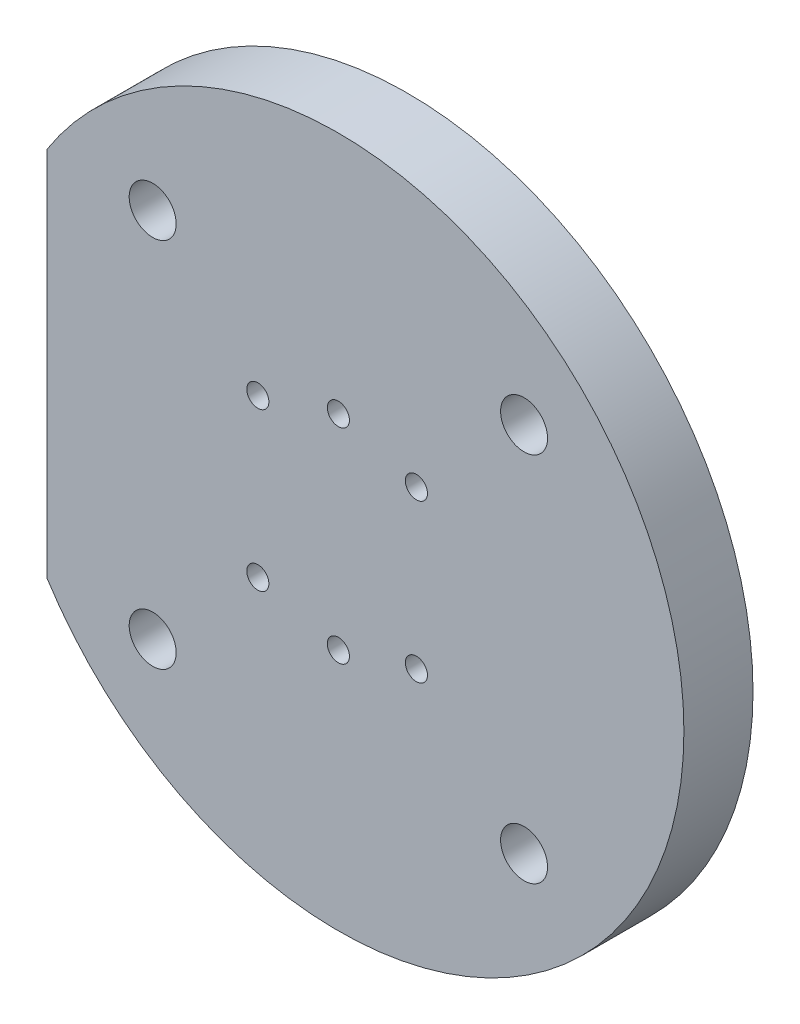
ISO-10303-21;
HEADER;
FILE_DESCRIPTION(('STEP AP214'),'2;1');
FILE_NAME('part.step','',(''),(''),'','','');
FILE_SCHEMA(('AUTOMOTIVE_DESIGN { 1 0 10303 214 1 1 1 1 }'));
ENDSEC;
DATA;
#1=APPLICATION_CONTEXT('core data for automotive mechanical design processes');
#2=APPLICATION_PROTOCOL_DEFINITION('international standard','automotive_design',2000,#1);
#3=PRODUCT_CONTEXT('',#1,'mechanical');
#4=PRODUCT('Part','Part','',(#3));
#5=PRODUCT_RELATED_PRODUCT_CATEGORY('part','',(#4));
#6=PRODUCT_DEFINITION_FORMATION('','',#4);
#7=PRODUCT_DEFINITION_CONTEXT('part definition',#1,'design');
#8=PRODUCT_DEFINITION('design','',#6,#7);
#9=PRODUCT_DEFINITION_SHAPE('','',#8);
#10=(LENGTH_UNIT() NAMED_UNIT(*) SI_UNIT(.MILLI.,.METRE.));
#11=(NAMED_UNIT(*) PLANE_ANGLE_UNIT() SI_UNIT($,.RADIAN.));
#12=(NAMED_UNIT(*) SI_UNIT($,.STERADIAN.) SOLID_ANGLE_UNIT());
#13=UNCERTAINTY_MEASURE_WITH_UNIT(LENGTH_MEASURE(1.E-05),#10,'distance_accuracy_value','');
#14=(GEOMETRIC_REPRESENTATION_CONTEXT(3) GLOBAL_UNCERTAINTY_ASSIGNED_CONTEXT((#13)) GLOBAL_UNIT_ASSIGNED_CONTEXT((#10,
#11,#12)) REPRESENTATION_CONTEXT('',''));
#15=CARTESIAN_POINT('',(0.,0.,0.));
#16=DIRECTION('',(0.,0.,1.));
#17=DIRECTION('',(1.,0.,0.));
#18=AXIS2_PLACEMENT_3D('',#15,#16,#17);
#19=CARTESIAN_POINT('',(0.,0.,5.));
#20=DIRECTION('',(0.,0.,1.));
#21=DIRECTION('',(1.,0.,0.));
#22=AXIS2_PLACEMENT_3D('',#19,#20,#21);
#23=PLANE('',#22);
#24=DIRECTION('',(0.,-1.,0.));
#25=VECTOR('',#24,1.);
#26=CARTESIAN_POINT('',(-21.083168642308,13.4350288425444,5.));
#27=LINE('',#26,#25);
#28=CARTESIAN_POINT('',(-21.083168642308,13.4350288425444,5.));
#29=VERTEX_POINT('',#28);
#30=CARTESIAN_POINT('',(-21.083168642308,-13.4350288425444,5.));
#31=VERTEX_POINT('',#30);
#32=EDGE_CURVE('E57',#29,#31,#27,.T.);
#33=ORIENTED_EDGE('',*,*,#32,.T.);
#34=CARTESIAN_POINT('',(0.,0.,5.));
#35=DIRECTION('',(0.,0.,1.));
#36=DIRECTION('',(1.,0.,0.));
#37=AXIS2_PLACEMENT_3D('',#34,#35,#36);
#38=CIRCLE('',#37,25.);
#39=EDGE_CURVE('E50',#31,#29,#38,.T.);
#40=ORIENTED_EDGE('',*,*,#39,.T.);
#41=EDGE_LOOP('',(#33,#40));
#42=FACE_BOUND('',#41,.T.);
#43=CARTESIAN_POINT('',(0.,7.39888219603912,5.));
#44=DIRECTION('',(0.,0.,-1.));
#45=DIRECTION('',(-1.,0.,0.));
#46=AXIS2_PLACEMENT_3D('',#43,#44,#45);
#47=CIRCLE('',#46,0.8);
#48=CARTESIAN_POINT('',(-0.8,7.39888219603912,5.));
#49=VERTEX_POINT('',#48);
#50=EDGE_CURVE('E115',#49,#49,#47,.T.);
#51=ORIENTED_EDGE('',*,*,#50,.T.);
#52=EDGE_LOOP('',(#51));
#53=FACE_BOUND('',#52,.T.);
#54=CARTESIAN_POINT('',(5.64508041336514,5.63428793634296,5.));
#55=DIRECTION('',(0.,0.,-1.));
#56=DIRECTION('',(-1.,0.,0.));
#57=AXIS2_PLACEMENT_3D('',#54,#55,#56);
#58=CIRCLE('',#57,0.8);
#59=CARTESIAN_POINT('',(4.84508041336514,5.63428793634296,5.));
#60=VERTEX_POINT('',#59);
#61=EDGE_CURVE('E124',#60,#60,#58,.T.);
#62=ORIENTED_EDGE('',*,*,#61,.T.);
#63=EDGE_LOOP('',(#62));
#64=FACE_BOUND('',#63,.T.);
#65=CARTESIAN_POINT('',(5.64508041336514,-5.7586937922313,5.));
#66=DIRECTION('',(0.,0.,-1.));
#67=DIRECTION('',(-1.,0.,0.));
#68=AXIS2_PLACEMENT_3D('',#65,#66,#67);
#69=CIRCLE('',#68,0.8);
#70=CARTESIAN_POINT('',(4.84508041336514,-5.7586937922313,5.));
#71=VERTEX_POINT('',#70);
#72=EDGE_CURVE('E123',#71,#71,#69,.T.);
#73=ORIENTED_EDGE('',*,*,#72,.T.);
#74=EDGE_LOOP('',(#73));
#75=FACE_BOUND('',#74,.T.);
#76=CARTESIAN_POINT('',(0.,-7.39888219603912,5.));
#77=DIRECTION('',(0.,0.,-1.));
#78=DIRECTION('',(-1.,0.,0.));
#79=AXIS2_PLACEMENT_3D('',#76,#77,#78);
#80=CIRCLE('',#79,0.8);
#81=CARTESIAN_POINT('',(-0.8,-7.39888219603912,5.));
#82=VERTEX_POINT('',#81);
#83=EDGE_CURVE('E132',#82,#82,#80,.T.);
#84=ORIENTED_EDGE('',*,*,#83,.T.);
#85=EDGE_LOOP('',(#84));
#86=FACE_BOUND('',#85,.T.);
#87=CARTESIAN_POINT('',(-5.82750673468573,-5.7586937922313,5.));
#88=DIRECTION('',(0.,0.,-1.));
#89=DIRECTION('',(-1.,0.,0.));
#90=AXIS2_PLACEMENT_3D('',#87,#88,#89);
#91=CIRCLE('',#90,0.8);
#92=CARTESIAN_POINT('',(-6.62750673468573,-5.7586937922313,5.));
#93=VERTEX_POINT('',#92);
#94=EDGE_CURVE('E140',#93,#93,#91,.T.);
#95=ORIENTED_EDGE('',*,*,#94,.T.);
#96=EDGE_LOOP('',(#95));
#97=FACE_BOUND('',#96,.T.);
#98=CARTESIAN_POINT('',(-5.82750673468573,5.63428793634296,5.));
#99=DIRECTION('',(0.,0.,-1.));
#100=DIRECTION('',(-1.,0.,0.));
#101=AXIS2_PLACEMENT_3D('',#98,#99,#100);
#102=CIRCLE('',#101,0.8);
#103=CARTESIAN_POINT('',(-6.62750673468573,5.63428793634296,5.));
#104=VERTEX_POINT('',#103);
#105=EDGE_CURVE('E148',#104,#104,#102,.T.);
#106=ORIENTED_EDGE('',*,*,#105,.T.);
#107=EDGE_LOOP('',(#106));
#108=FACE_BOUND('',#107,.T.);
#109=CARTESIAN_POINT('',(13.4350288425444,-13.4350288425444,5.));
#110=DIRECTION('',(0.,0.,1.));
#111=DIRECTION('',(1.,0.,0.));
#112=AXIS2_PLACEMENT_3D('',#109,#110,#111);
#113=CIRCLE('',#112,1.7);
#114=CARTESIAN_POINT('',(15.1350288425444,-13.4350288425444,5.));
#115=VERTEX_POINT('',#114);
#116=EDGE_CURVE('E99',#115,#115,#113,.T.);
#117=ORIENTED_EDGE('',*,*,#116,.F.);
#118=EDGE_LOOP('',(#117));
#119=FACE_BOUND('',#118,.T.);
#120=CARTESIAN_POINT('',(13.4350288425444,13.4350288425444,5.));
#121=DIRECTION('',(0.,0.,1.));
#122=DIRECTION('',(1.,0.,0.));
#123=AXIS2_PLACEMENT_3D('',#120,#121,#122);
#124=CIRCLE('',#123,1.7);
#125=CARTESIAN_POINT('',(15.1350288425444,13.4350288425444,5.));
#126=VERTEX_POINT('',#125);
#127=EDGE_CURVE('E83',#126,#126,#124,.T.);
#128=ORIENTED_EDGE('',*,*,#127,.F.);
#129=EDGE_LOOP('',(#128));
#130=FACE_BOUND('',#129,.T.);
#131=CARTESIAN_POINT('',(-13.4350288425444,13.4350288425444,5.));
#132=DIRECTION('',(0.,0.,1.));
#133=DIRECTION('',(1.,0.,0.));
#134=AXIS2_PLACEMENT_3D('',#131,#132,#133);
#135=CIRCLE('',#134,1.7);
#136=CARTESIAN_POINT('',(-11.7350288425444,13.4350288425444,5.));
#137=VERTEX_POINT('',#136);
#138=EDGE_CURVE('E93',#137,#137,#135,.T.);
#139=ORIENTED_EDGE('',*,*,#138,.F.);
#140=EDGE_LOOP('',(#139));
#141=FACE_BOUND('',#140,.T.);
#142=CARTESIAN_POINT('',(-13.4350288425444,-13.4350288425444,5.));
#143=DIRECTION('',(0.,0.,1.));
#144=DIRECTION('',(1.,0.,0.));
#145=AXIS2_PLACEMENT_3D('',#142,#143,#144);
#146=CIRCLE('',#145,1.7);
#147=CARTESIAN_POINT('',(-11.7350288425444,-13.4350288425444,5.));
#148=VERTEX_POINT('',#147);
#149=EDGE_CURVE('E107',#148,#148,#146,.T.);
#150=ORIENTED_EDGE('',*,*,#149,.F.);
#151=EDGE_LOOP('',(#150));
#152=FACE_BOUND('',#151,.T.);
#153=ADVANCED_FACE('F41',(#42,#53,#64,#75,#86,#97,#108,#119,#130,#141,#152),#23,.T.);
#154=CARTESIAN_POINT('',(0.,0.,0.));
#155=DIRECTION('',(0.,0.,1.));
#156=DIRECTION('',(1.,0.,0.));
#157=AXIS2_PLACEMENT_3D('',#154,#155,#156);
#158=PLANE('',#157);
#159=CARTESIAN_POINT('',(0.,7.39888219603912,0.));
#160=DIRECTION('',(0.,0.,-1.));
#161=DIRECTION('',(-1.,0.,0.));
#162=AXIS2_PLACEMENT_3D('',#159,#160,#161);
#163=CIRCLE('',#162,0.8);
#164=CARTESIAN_POINT('',(-0.8,7.39888219603912,0.));
#165=VERTEX_POINT('',#164);
#166=EDGE_CURVE('E152',#165,#165,#163,.T.);
#167=ORIENTED_EDGE('',*,*,#166,.F.);
#168=EDGE_LOOP('',(#167));
#169=FACE_BOUND('',#168,.T.);
#170=CARTESIAN_POINT('',(5.64508041336514,5.63428793634296,0.));
#171=DIRECTION('',(0.,0.,-1.));
#172=DIRECTION('',(-1.,0.,0.));
#173=AXIS2_PLACEMENT_3D('',#170,#171,#172);
#174=CIRCLE('',#173,0.8);
#175=CARTESIAN_POINT('',(4.84508041336514,5.63428793634296,0.));
#176=VERTEX_POINT('',#175);
#177=EDGE_CURVE('E73',#176,#176,#174,.T.);
#178=ORIENTED_EDGE('',*,*,#177,.F.);
#179=EDGE_LOOP('',(#178));
#180=FACE_BOUND('',#179,.T.);
#181=CARTESIAN_POINT('',(5.64508041336514,-5.7586937922313,0.));
#182=DIRECTION('',(0.,0.,-1.));
#183=DIRECTION('',(-1.,0.,0.));
#184=AXIS2_PLACEMENT_3D('',#181,#182,#183);
#185=CIRCLE('',#184,0.8);
#186=CARTESIAN_POINT('',(4.84508041336514,-5.7586937922313,0.));
#187=VERTEX_POINT('',#186);
#188=EDGE_CURVE('E119',#187,#187,#185,.T.);
#189=ORIENTED_EDGE('',*,*,#188,.F.);
#190=EDGE_LOOP('',(#189));
#191=FACE_BOUND('',#190,.T.);
#192=CARTESIAN_POINT('',(0.,-7.39888219603912,0.));
#193=DIRECTION('',(0.,0.,-1.));
#194=DIRECTION('',(-1.,0.,0.));
#195=AXIS2_PLACEMENT_3D('',#192,#193,#194);
#196=CIRCLE('',#195,0.8);
#197=CARTESIAN_POINT('',(-0.8,-7.39888219603912,0.));
#198=VERTEX_POINT('',#197);
#199=EDGE_CURVE('E128',#198,#198,#196,.T.);
#200=ORIENTED_EDGE('',*,*,#199,.F.);
#201=EDGE_LOOP('',(#200));
#202=FACE_BOUND('',#201,.T.);
#203=CARTESIAN_POINT('',(-5.82750673468573,-5.7586937922313,0.));
#204=DIRECTION('',(0.,0.,-1.));
#205=DIRECTION('',(-1.,0.,0.));
#206=AXIS2_PLACEMENT_3D('',#203,#204,#205);
#207=CIRCLE('',#206,0.8);
#208=CARTESIAN_POINT('',(-6.62750673468573,-5.7586937922313,0.));
#209=VERTEX_POINT('',#208);
#210=EDGE_CURVE('E136',#209,#209,#207,.T.);
#211=ORIENTED_EDGE('',*,*,#210,.F.);
#212=EDGE_LOOP('',(#211));
#213=FACE_BOUND('',#212,.T.);
#214=CARTESIAN_POINT('',(-5.82750673468573,5.63428793634296,0.));
#215=DIRECTION('',(0.,0.,-1.));
#216=DIRECTION('',(-1.,0.,0.));
#217=AXIS2_PLACEMENT_3D('',#214,#215,#216);
#218=CIRCLE('',#217,0.8);
#219=CARTESIAN_POINT('',(-6.62750673468573,5.63428793634296,0.));
#220=VERTEX_POINT('',#219);
#221=EDGE_CURVE('E144',#220,#220,#218,.T.);
#222=ORIENTED_EDGE('',*,*,#221,.F.);
#223=EDGE_LOOP('',(#222));
#224=FACE_BOUND('',#223,.T.);
#225=CARTESIAN_POINT('',(0.,0.,0.));
#226=DIRECTION('',(0.,0.,1.));
#227=DIRECTION('',(1.,0.,0.));
#228=AXIS2_PLACEMENT_3D('',#225,#226,#227);
#229=CIRCLE('',#228,25.);
#230=CARTESIAN_POINT('',(-21.083168642308,-13.4350288425444,0.));
#231=VERTEX_POINT('',#230);
#232=CARTESIAN_POINT('',(-21.083168642308,13.4350288425444,0.));
#233=VERTEX_POINT('',#232);
#234=EDGE_CURVE('E79',#231,#233,#229,.T.);
#235=ORIENTED_EDGE('',*,*,#234,.F.);
#236=DIRECTION('',(0.,-1.,0.));
#237=VECTOR('',#236,1.);
#238=CARTESIAN_POINT('',(-21.083168642308,13.4350288425444,0.));
#239=LINE('',#238,#237);
#240=EDGE_CURVE('E67',#233,#231,#239,.T.);
#241=ORIENTED_EDGE('',*,*,#240,.F.);
#242=EDGE_LOOP('',(#235,#241));
#243=FACE_BOUND('',#242,.T.);
#244=CARTESIAN_POINT('',(13.4350288425444,13.4350288425444,0.));
#245=DIRECTION('',(0.,0.,1.));
#246=DIRECTION('',(1.,0.,0.));
#247=AXIS2_PLACEMENT_3D('',#244,#245,#246);
#248=CIRCLE('',#247,1.7);
#249=CARTESIAN_POINT('',(15.1350288425444,13.4350288425444,0.));
#250=VERTEX_POINT('',#249);
#251=EDGE_CURVE('E88',#250,#250,#248,.T.);
#252=ORIENTED_EDGE('',*,*,#251,.T.);
#253=EDGE_LOOP('',(#252));
#254=FACE_BOUND('',#253,.T.);
#255=CARTESIAN_POINT('',(-13.4350288425444,13.4350288425444,0.));
#256=DIRECTION('',(0.,0.,1.));
#257=DIRECTION('',(1.,0.,0.));
#258=AXIS2_PLACEMENT_3D('',#255,#256,#257);
#259=CIRCLE('',#258,1.7);
#260=CARTESIAN_POINT('',(-11.7350288425444,13.4350288425444,0.));
#261=VERTEX_POINT('',#260);
#262=EDGE_CURVE('E95',#261,#261,#259,.T.);
#263=ORIENTED_EDGE('',*,*,#262,.T.);
#264=EDGE_LOOP('',(#263));
#265=FACE_BOUND('',#264,.T.);
#266=CARTESIAN_POINT('',(13.4350288425444,-13.4350288425444,0.));
#267=DIRECTION('',(0.,0.,1.));
#268=DIRECTION('',(1.,0.,0.));
#269=AXIS2_PLACEMENT_3D('',#266,#267,#268);
#270=CIRCLE('',#269,1.7);
#271=CARTESIAN_POINT('',(15.1350288425444,-13.4350288425444,0.));
#272=VERTEX_POINT('',#271);
#273=EDGE_CURVE('E103',#272,#272,#270,.T.);
#274=ORIENTED_EDGE('',*,*,#273,.T.);
#275=EDGE_LOOP('',(#274));
#276=FACE_BOUND('',#275,.T.);
#277=CARTESIAN_POINT('',(-13.4350288425444,-13.4350288425444,0.));
#278=DIRECTION('',(0.,0.,1.));
#279=DIRECTION('',(1.,0.,0.));
#280=AXIS2_PLACEMENT_3D('',#277,#278,#279);
#281=CIRCLE('',#280,1.7);
#282=CARTESIAN_POINT('',(-11.7350288425444,-13.4350288425444,0.));
#283=VERTEX_POINT('',#282);
#284=EDGE_CURVE('E111',#283,#283,#281,.T.);
#285=ORIENTED_EDGE('',*,*,#284,.T.);
#286=EDGE_LOOP('',(#285));
#287=FACE_BOUND('',#286,.T.);
#288=ADVANCED_FACE('F77',(#169,#180,#191,#202,#213,#224,#243,#254,#265,#276,#287),#158,.F.);
#289=CARTESIAN_POINT('',(0.,0.,5.));
#290=DIRECTION('',(0.,0.,-1.));
#291=DIRECTION('',(-1.,0.,0.));
#292=AXIS2_PLACEMENT_3D('',#289,#290,#291);
#293=CYLINDRICAL_SURFACE('',#292,25.);
#294=ORIENTED_EDGE('',*,*,#39,.F.);
#295=DIRECTION('',(0.,0.,-1.));
#296=VECTOR('',#295,1.);
#297=CARTESIAN_POINT('',(-21.083168642308,-13.4350288425444,5.));
#298=LINE('',#297,#296);
#299=EDGE_CURVE('E11',#31,#231,#298,.T.);
#300=ORIENTED_EDGE('',*,*,#299,.T.);
#301=ORIENTED_EDGE('',*,*,#234,.T.);
#302=DIRECTION('',(0.,0.,-1.));
#303=VECTOR('',#302,1.);
#304=CARTESIAN_POINT('',(-21.083168642308,13.4350288425444,5.));
#305=LINE('',#304,#303);
#306=EDGE_CURVE('E64',#29,#233,#305,.T.);
#307=ORIENTED_EDGE('',*,*,#306,.F.);
#308=EDGE_LOOP('',(#294,#300,#301,#307));
#309=FACE_BOUND('',#308,.T.);
#310=ADVANCED_FACE('F43',(#309),#293,.T.);
#311=CARTESIAN_POINT('',(13.4350288425444,13.4350288425444,5.));
#312=DIRECTION('',(0.,0.,-1.));
#313=DIRECTION('',(-1.,0.,0.));
#314=AXIS2_PLACEMENT_3D('',#311,#312,#313);
#315=CYLINDRICAL_SURFACE('',#314,1.7);
#316=ORIENTED_EDGE('',*,*,#127,.T.);
#317=EDGE_LOOP('',(#316));
#318=FACE_BOUND('',#317,.T.);
#319=ORIENTED_EDGE('',*,*,#251,.F.);
#320=EDGE_LOOP('',(#319));
#321=FACE_BOUND('',#320,.T.);
#322=ADVANCED_FACE('F203',(#318,#321),#315,.F.);
#323=CARTESIAN_POINT('',(-13.4350288425444,13.4350288425444,5.));
#324=DIRECTION('',(0.,0.,-1.));
#325=DIRECTION('',(-1.,0.,0.));
#326=AXIS2_PLACEMENT_3D('',#323,#324,#325);
#327=CYLINDRICAL_SURFACE('',#326,1.7);
#328=ORIENTED_EDGE('',*,*,#138,.T.);
#329=EDGE_LOOP('',(#328));
#330=FACE_BOUND('',#329,.T.);
#331=ORIENTED_EDGE('',*,*,#262,.F.);
#332=EDGE_LOOP('',(#331));
#333=FACE_BOUND('',#332,.T.);
#334=ADVANCED_FACE('F209',(#330,#333),#327,.F.);
#335=CARTESIAN_POINT('',(13.4350288425444,-13.4350288425444,5.));
#336=DIRECTION('',(0.,0.,-1.));
#337=DIRECTION('',(-1.,0.,0.));
#338=AXIS2_PLACEMENT_3D('',#335,#336,#337);
#339=CYLINDRICAL_SURFACE('',#338,1.7);
#340=ORIENTED_EDGE('',*,*,#116,.T.);
#341=EDGE_LOOP('',(#340));
#342=FACE_BOUND('',#341,.T.);
#343=ORIENTED_EDGE('',*,*,#273,.F.);
#344=EDGE_LOOP('',(#343));
#345=FACE_BOUND('',#344,.T.);
#346=ADVANCED_FACE('F194',(#342,#345),#339,.F.);
#347=CARTESIAN_POINT('',(-13.4350288425444,-13.4350288425444,5.));
#348=DIRECTION('',(0.,0.,-1.));
#349=DIRECTION('',(-1.,0.,0.));
#350=AXIS2_PLACEMENT_3D('',#347,#348,#349);
#351=CYLINDRICAL_SURFACE('',#350,1.7);
#352=ORIENTED_EDGE('',*,*,#149,.T.);
#353=EDGE_LOOP('',(#352));
#354=FACE_BOUND('',#353,.T.);
#355=ORIENTED_EDGE('',*,*,#284,.F.);
#356=EDGE_LOOP('',(#355));
#357=FACE_BOUND('',#356,.T.);
#358=ADVANCED_FACE('F190',(#354,#357),#351,.F.);
#359=CARTESIAN_POINT('',(-5.82750673468573,5.63428793634296,5.));
#360=DIRECTION('',(0.,0.,-1.));
#361=DIRECTION('',(-1.,0.,0.));
#362=AXIS2_PLACEMENT_3D('',#359,#360,#361);
#363=CYLINDRICAL_SURFACE('',#362,0.8);
#364=ORIENTED_EDGE('',*,*,#105,.F.);
#365=EDGE_LOOP('',(#364));
#366=FACE_BOUND('',#365,.T.);
#367=ORIENTED_EDGE('',*,*,#221,.T.);
#368=EDGE_LOOP('',(#367));
#369=FACE_BOUND('',#368,.T.);
#370=ADVANCED_FACE('F193',(#366,#369),#363,.F.);
#371=CARTESIAN_POINT('',(-5.82750673468573,-5.7586937922313,5.));
#372=DIRECTION('',(0.,0.,-1.));
#373=DIRECTION('',(-1.,0.,0.));
#374=AXIS2_PLACEMENT_3D('',#371,#372,#373);
#375=CYLINDRICAL_SURFACE('',#374,0.8);
#376=ORIENTED_EDGE('',*,*,#94,.F.);
#377=EDGE_LOOP('',(#376));
#378=FACE_BOUND('',#377,.T.);
#379=ORIENTED_EDGE('',*,*,#210,.T.);
#380=EDGE_LOOP('',(#379));
#381=FACE_BOUND('',#380,.T.);
#382=ADVANCED_FACE('F225',(#378,#381),#375,.F.);
#383=CARTESIAN_POINT('',(0.,-7.39888219603912,5.));
#384=DIRECTION('',(0.,0.,-1.));
#385=DIRECTION('',(-1.,0.,0.));
#386=AXIS2_PLACEMENT_3D('',#383,#384,#385);
#387=CYLINDRICAL_SURFACE('',#386,0.8);
#388=ORIENTED_EDGE('',*,*,#83,.F.);
#389=EDGE_LOOP('',(#388));
#390=FACE_BOUND('',#389,.T.);
#391=ORIENTED_EDGE('',*,*,#199,.T.);
#392=EDGE_LOOP('',(#391));
#393=FACE_BOUND('',#392,.T.);
#394=ADVANCED_FACE('F221',(#390,#393),#387,.F.);
#395=CARTESIAN_POINT('',(5.64508041336514,-5.7586937922313,5.));
#396=DIRECTION('',(0.,0.,-1.));
#397=DIRECTION('',(-1.,0.,0.));
#398=AXIS2_PLACEMENT_3D('',#395,#396,#397);
#399=CYLINDRICAL_SURFACE('',#398,0.8);
#400=ORIENTED_EDGE('',*,*,#72,.F.);
#401=EDGE_LOOP('',(#400));
#402=FACE_BOUND('',#401,.T.);
#403=ORIENTED_EDGE('',*,*,#188,.T.);
#404=EDGE_LOOP('',(#403));
#405=FACE_BOUND('',#404,.T.);
#406=ADVANCED_FACE('F217',(#402,#405),#399,.F.);
#407=CARTESIAN_POINT('',(5.64508041336514,5.63428793634296,5.));
#408=DIRECTION('',(0.,0.,-1.));
#409=DIRECTION('',(-1.,0.,0.));
#410=AXIS2_PLACEMENT_3D('',#407,#408,#409);
#411=CYLINDRICAL_SURFACE('',#410,0.8);
#412=ORIENTED_EDGE('',*,*,#61,.F.);
#413=EDGE_LOOP('',(#412));
#414=FACE_BOUND('',#413,.T.);
#415=ORIENTED_EDGE('',*,*,#177,.T.);
#416=EDGE_LOOP('',(#415));
#417=FACE_BOUND('',#416,.T.);
#418=ADVANCED_FACE('F220',(#414,#417),#411,.F.);
#419=CARTESIAN_POINT('',(0.,7.39888219603912,5.));
#420=DIRECTION('',(0.,0.,-1.));
#421=DIRECTION('',(-1.,0.,0.));
#422=AXIS2_PLACEMENT_3D('',#419,#420,#421);
#423=CYLINDRICAL_SURFACE('',#422,0.8);
#424=ORIENTED_EDGE('',*,*,#50,.F.);
#425=EDGE_LOOP('',(#424));
#426=FACE_BOUND('',#425,.T.);
#427=ORIENTED_EDGE('',*,*,#166,.T.);
#428=EDGE_LOOP('',(#427));
#429=FACE_BOUND('',#428,.T.);
#430=ADVANCED_FACE('F235',(#426,#429),#423,.F.);
#431=CARTESIAN_POINT('',(-21.083168642308,13.4350288425444,5.));
#432=DIRECTION('',(1.,0.,0.));
#433=DIRECTION('',(0.,0.,-1.));
#434=AXIS2_PLACEMENT_3D('',#431,#432,#433);
#435=PLANE('',#434);
#436=ORIENTED_EDGE('',*,*,#32,.F.);
#437=ORIENTED_EDGE('',*,*,#306,.T.);
#438=ORIENTED_EDGE('',*,*,#240,.T.);
#439=ORIENTED_EDGE('',*,*,#299,.F.);
#440=EDGE_LOOP('',(#436,#437,#438,#439));
#441=FACE_BOUND('',#440,.T.);
#442=ADVANCED_FACE('F66',(#441),#435,.F.);
#443=CLOSED_SHELL('',(#153,#288,#310,#322,#334,#346,#358,#370,#382,#394,#406,#418,#430,#442));
#444=MANIFOLD_SOLID_BREP('B2',#443);
#445=ADVANCED_BREP_SHAPE_REPRESENTATION('',(#18,#444),#14);
#446=SHAPE_DEFINITION_REPRESENTATION(#9,#445);
ENDSEC;
END-ISO-10303-21;
